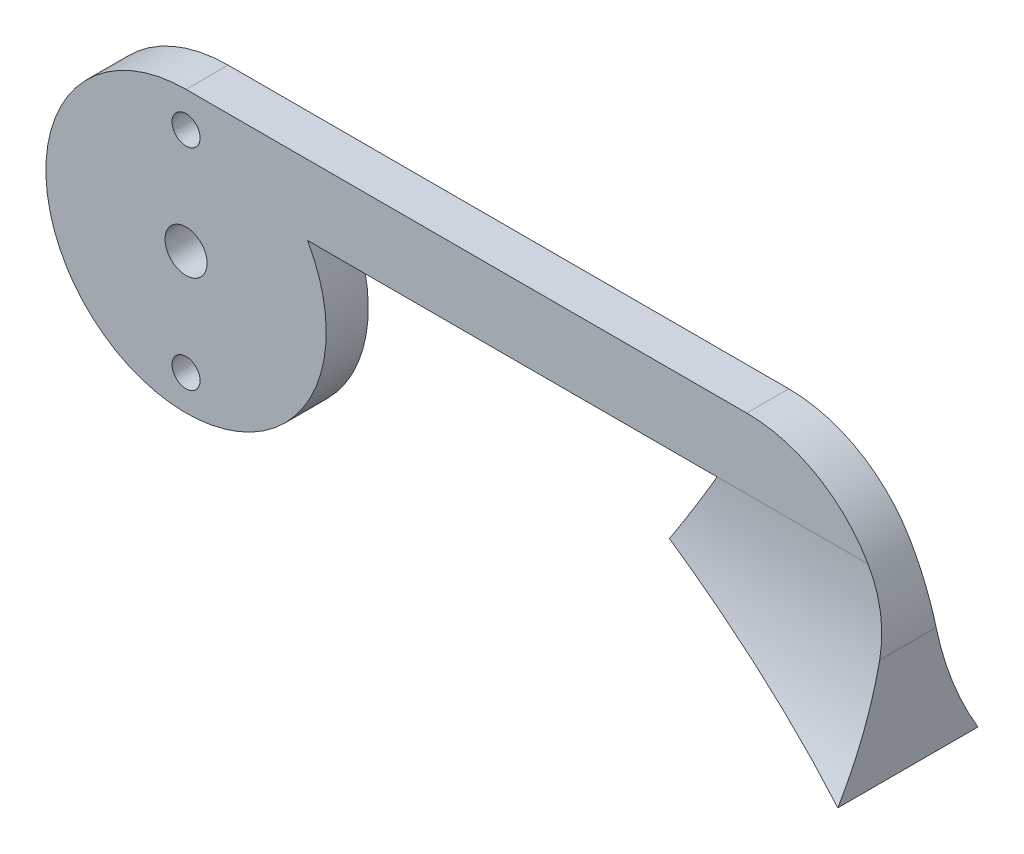
ISO-10303-21;
HEADER;
FILE_DESCRIPTION(('STEP AP214'),'2;1');
FILE_NAME('part.step','',(''),(''),'','','');
FILE_SCHEMA(('AUTOMOTIVE_DESIGN { 1 0 10303 214 1 1 1 1 }'));
ENDSEC;
DATA;
#1=APPLICATION_CONTEXT('core data for automotive mechanical design processes');
#2=APPLICATION_PROTOCOL_DEFINITION('international standard','automotive_design',2000,#1);
#3=PRODUCT_CONTEXT('',#1,'mechanical');
#4=PRODUCT('Part','Part','',(#3));
#5=PRODUCT_RELATED_PRODUCT_CATEGORY('part','',(#4));
#6=PRODUCT_DEFINITION_FORMATION('','',#4);
#7=PRODUCT_DEFINITION_CONTEXT('part definition',#1,'design');
#8=PRODUCT_DEFINITION('design','',#6,#7);
#9=PRODUCT_DEFINITION_SHAPE('','',#8);
#10=(LENGTH_UNIT() NAMED_UNIT(*) SI_UNIT(.MILLI.,.METRE.));
#11=(NAMED_UNIT(*) PLANE_ANGLE_UNIT() SI_UNIT($,.RADIAN.));
#12=(NAMED_UNIT(*) SI_UNIT($,.STERADIAN.) SOLID_ANGLE_UNIT());
#13=UNCERTAINTY_MEASURE_WITH_UNIT(LENGTH_MEASURE(1.E-05),#10,'distance_accuracy_value','');
#14=(GEOMETRIC_REPRESENTATION_CONTEXT(3) GLOBAL_UNCERTAINTY_ASSIGNED_CONTEXT((#13)) GLOBAL_UNIT_ASSIGNED_CONTEXT((#10,
#11,#12)) REPRESENTATION_CONTEXT('',''));
#15=CARTESIAN_POINT('',(0.,0.,0.));
#16=DIRECTION('',(0.,0.,1.));
#17=DIRECTION('',(1.,0.,0.));
#18=AXIS2_PLACEMENT_3D('',#15,#16,#17);
#19=CARTESIAN_POINT('',(40.,0.,1.5));
#20=DIRECTION('',(0.,0.,-1.));
#21=DIRECTION('',(-1.,0.,0.));
#22=AXIS2_PLACEMENT_3D('',#19,#20,#21);
#23=CYLINDRICAL_SURFACE('',#22,10.);
#24=CARTESIAN_POINT('',(40.,0.,1.5));
#25=DIRECTION('',(0.,0.,1.));
#26=DIRECTION('',(0.,-1.,0.));
#27=AXIS2_PLACEMENT_3D('',#24,#25,#26);
#28=CIRCLE('',#27,10.);
#29=CARTESIAN_POINT('',(48.6602540378444,5.,1.5));
#30=VERTEX_POINT('',#29);
#31=CARTESIAN_POINT('',(40.,10.,1.5));
#32=VERTEX_POINT('',#31);
#33=EDGE_CURVE('E153',#30,#32,#28,.T.);
#34=ORIENTED_EDGE('',*,*,#33,.F.);
#35=CARTESIAN_POINT('',(50.,0.,2.01381698103371));
#36=CARTESIAN_POINT('',(50.0000415045389,0.262517746514176,1.95924422946565));
#37=CARTESIAN_POINT('',(49.9896640405455,0.525969076046815,1.90904097072346));
#38=CARTESIAN_POINT('',(49.9479242579216,1.05281929866364,1.81747608824705));
#39=CARTESIAN_POINT('',(49.9165560923865,1.31621815667785,1.77611693225119));
#40=CARTESIAN_POINT('',(49.8336581317333,1.83482498523233,1.70322663335835));
#41=CARTESIAN_POINT('',(49.7826116569452,2.09008145645234,1.67149022231397));
#42=CARTESIAN_POINT('',(49.6605076110851,2.59661387865083,1.61643458150186));
#43=CARTESIAN_POINT('',(49.589457201437,2.84789122021869,1.59311234625727));
#44=CARTESIAN_POINT('',(49.4552349147342,3.2601009370102,1.56109344195631));
#45=CARTESIAN_POINT('',(49.3976050194521,3.42268848799356,1.5501203528109));
#46=CARTESIAN_POINT('',(49.2739310376327,3.74485929821452,1.53153076595463));
#47=CARTESIAN_POINT('',(49.2078859667352,3.9044422034749,1.52391466139056));
#48=CARTESIAN_POINT('',(49.0664744965941,4.22253489501877,1.511773100261));
#49=CARTESIAN_POINT('',(48.99097859854,4.38098897206747,1.50729778407826));
#50=CARTESIAN_POINT('',(48.8317426463199,4.6937345730493,1.50140899832391));
#51=CARTESIAN_POINT('',(48.7480035651893,4.8480265855449,1.49999516782276));
#52=CARTESIAN_POINT('',(48.6602540378444,5.,1.5));
#53=B_SPLINE_CURVE_WITH_KNOTS('',3,(#35,#36,#37,#38,#39,#40,#41,#42,#43,#44,#45,#46,#47,#48,#49,
#50,#51,#52),.UNSPECIFIED.,.F.,.F.,(4,2,2,2,2,2,2,2,4),(0.,0.804192014353112,1.60860812757328,
2.3944106535297,3.1799322185136,3.69823554748103,4.21659956042801,4.74306139262274,
5.26946115496263),.UNSPECIFIED.);
#54=CARTESIAN_POINT('',(50.,0.,2.01381698103371));
#55=VERTEX_POINT('',#54);
#56=EDGE_CURVE('E158',#55,#30,#53,.T.);
#57=ORIENTED_EDGE('',*,*,#56,.F.);
#58=DIRECTION('',(0.,0.,-1.));
#59=VECTOR('',#58,1.);
#60=CARTESIAN_POINT('',(50.,0.,1.5));
#61=LINE('',#60,#59);
#62=CARTESIAN_POINT('',(50.,0.,-2.01381698103371));
#63=VERTEX_POINT('',#62);
#64=EDGE_CURVE('E104',#55,#63,#61,.T.);
#65=ORIENTED_EDGE('',*,*,#64,.T.);
#66=CARTESIAN_POINT('',(48.6602540378444,5.,-1.5));
#67=CARTESIAN_POINT('',(48.794355888389,4.76780427374725,-1.49997140067746));
#68=CARTESIAN_POINT('',(48.9190604891211,4.53016700286462,-1.50328833526677));
#69=CARTESIAN_POINT('',(49.1489604372385,4.04576558179694,-1.51733830242921));
#70=CARTESIAN_POINT('',(49.254150184041,3.79899883583262,-1.5280734598002));
#71=CARTESIAN_POINT('',(49.4420276477239,3.30402666138642,-1.55734296133096));
#72=CARTESIAN_POINT('',(49.5251799428244,3.05598680798395,-1.575690987092));
#73=CARTESIAN_POINT('',(49.6716207318108,2.55497067220455,-1.62059238127503));
#74=CARTESIAN_POINT('',(49.7349163990032,2.30199620764165,-1.64714277965324));
#75=CARTESIAN_POINT('',(49.8584240534306,1.71146035006233,-1.71859254938625));
#76=CARTESIAN_POINT('',(49.9112019486332,1.3726752219491,-1.76664375054361));
#77=CARTESIAN_POINT('',(49.9643626537235,0.861142448873515,-1.85026384890052));
#78=CARTESIAN_POINT('',(49.9777482297035,0.688716605837885,-1.88034162525464));
#79=CARTESIAN_POINT('',(49.9955673365444,0.344078285002523,-1.94426629767427));
#80=CARTESIAN_POINT('',(49.9999997647795,0.171865836093102,-1.97811365744167));
#81=CARTESIAN_POINT('',(50.,0.,-2.01381698103371));
#82=B_SPLINE_CURVE_WITH_KNOTS('',3,(#66,#67,#68,#69,#70,#71,#72,#73,#74,#75,#76,#77,#78,#79,#80,
#81),.UNSPECIFIED.,.F.,.F.,(4,2,2,2,2,2,2,4),(0.,0.804195556242593,1.60862155334646,
2.39442372995741,3.17994170382442,4.21620915085749,4.74260477274713,5.26906521899086),.UNSPECIFIED.);
#83=CARTESIAN_POINT('',(48.6602540378444,5.,-1.5));
#84=VERTEX_POINT('',#83);
#85=EDGE_CURVE('E49',#84,#63,#82,.T.);
#86=ORIENTED_EDGE('',*,*,#85,.F.);
#87=CARTESIAN_POINT('',(40.,0.,-1.5));
#88=DIRECTION('',(0.,0.,-1.));
#89=DIRECTION('',(0.,1.,0.));
#90=AXIS2_PLACEMENT_3D('',#87,#88,#89);
#91=CIRCLE('',#90,10.);
#92=CARTESIAN_POINT('',(40.,10.,-1.5));
#93=VERTEX_POINT('',#92);
#94=EDGE_CURVE('E157',#93,#84,#91,.T.);
#95=ORIENTED_EDGE('',*,*,#94,.F.);
#96=DIRECTION('',(0.,0.,-1.));
#97=VECTOR('',#96,1.);
#98=CARTESIAN_POINT('',(40.,10.,1.5));
#99=LINE('',#98,#97);
#100=EDGE_CURVE('E78',#32,#93,#99,.T.);
#101=ORIENTED_EDGE('',*,*,#100,.F.);
#102=EDGE_LOOP('',(#34,#57,#65,#86,#95,#101));
#103=FACE_BOUND('',#102,.T.);
#104=ADVANCED_FACE('F34',(#103),#23,.T.);
#105=CARTESIAN_POINT('',(0.,10.,1.5));
#106=DIRECTION('',(0.,-1.,0.));
#107=DIRECTION('',(0.,0.,-1.));
#108=AXIS2_PLACEMENT_3D('',#105,#106,#107);
#109=PLANE('',#108);
#110=DIRECTION('',(-1.,0.,0.));
#111=VECTOR('',#110,1.);
#112=CARTESIAN_POINT('',(0.,10.,1.5));
#113=LINE('',#112,#111);
#114=CARTESIAN_POINT('',(0.,10.,1.5));
#115=VERTEX_POINT('',#114);
#116=EDGE_CURVE('E58',#32,#115,#113,.T.);
#117=ORIENTED_EDGE('',*,*,#116,.F.);
#118=ORIENTED_EDGE('',*,*,#100,.T.);
#119=DIRECTION('',(-1.,0.,0.));
#120=VECTOR('',#119,1.);
#121=CARTESIAN_POINT('',(0.,10.,-1.5));
#122=LINE('',#121,#120);
#123=CARTESIAN_POINT('',(0.,10.,-1.5));
#124=VERTEX_POINT('',#123);
#125=EDGE_CURVE('E72',#93,#124,#122,.T.);
#126=ORIENTED_EDGE('',*,*,#125,.T.);
#127=DIRECTION('',(0.,0.,-1.));
#128=VECTOR('',#127,1.);
#129=CARTESIAN_POINT('',(0.,10.,1.5));
#130=LINE('',#129,#128);
#131=EDGE_CURVE('E75',#115,#124,#130,.T.);
#132=ORIENTED_EDGE('',*,*,#131,.F.);
#133=EDGE_LOOP('',(#117,#118,#126,#132));
#134=FACE_BOUND('',#133,.T.);
#135=ADVANCED_FACE('F74',(#134),#109,.F.);
#136=CARTESIAN_POINT('',(50.,-7.64288174241645,5.));
#137=DIRECTION('',(0.453990499739548,0.891006524188367,0.));
#138=DIRECTION('',(-0.891006524188367,0.453990499739548,0.));
#139=AXIS2_PLACEMENT_3D('',#136,#137,#138);
#140=PLANE('',#139);
#141=CARTESIAN_POINT('',(25.1869474724743,5.,26.0846369646753));
#142=DIRECTION('',(0.453990499739548,0.891006524188367,0.));
#143=DIRECTION('',(-0.891006524188367,0.453990499739548,0.));
#144=AXIS2_PLACEMENT_3D('',#141,#142,#143);
#145=ELLIPSE('',#144,54.1523159158163,24.5846369646753);
#146=CARTESIAN_POINT('',(35.,0.,2.0138169810337));
#147=VERTEX_POINT('',#146);
#148=CARTESIAN_POINT('',(50.,-7.64288174241645,5.));
#149=VERTEX_POINT('',#148);
#150=EDGE_CURVE('E209',#147,#149,#145,.F.);
#151=ORIENTED_EDGE('',*,*,#150,.F.);
#152=DIRECTION('',(0.,0.,-1.));
#153=VECTOR('',#152,1.);
#154=CARTESIAN_POINT('',(35.,0.,1.5));
#155=LINE('',#154,#153);
#156=CARTESIAN_POINT('',(35.,0.,-2.0138169810337));
#157=VERTEX_POINT('',#156);
#158=EDGE_CURVE('E107',#147,#157,#155,.T.);
#159=ORIENTED_EDGE('',*,*,#158,.T.);
#160=CARTESIAN_POINT('',(25.1869474724743,5.,-26.0846369646753));
#161=DIRECTION('',(0.453990499739548,0.891006524188367,0.));
#162=DIRECTION('',(-0.891006524188367,0.453990499739548,0.));
#163=AXIS2_PLACEMENT_3D('',#160,#161,#162);
#164=ELLIPSE('',#163,54.1523159158163,24.5846369646753);
#165=CARTESIAN_POINT('',(50.,-7.64288174241644,-5.));
#166=VERTEX_POINT('',#165);
#167=EDGE_CURVE('E228',#166,#157,#164,.F.);
#168=ORIENTED_EDGE('',*,*,#167,.F.);
#169=DIRECTION('',(0.,0.,-1.));
#170=VECTOR('',#169,1.);
#171=CARTESIAN_POINT('',(50.,-7.64288174241645,5.));
#172=LINE('',#171,#170);
#173=EDGE_CURVE('E160',#149,#166,#172,.T.);
#174=ORIENTED_EDGE('',*,*,#173,.F.);
#175=EDGE_LOOP('',(#151,#159,#168,#174));
#176=FACE_BOUND('',#175,.T.);
#177=ADVANCED_FACE('F191',(#176),#140,.F.);
#178=CARTESIAN_POINT('',(0.,0.,1.5));
#179=DIRECTION('',(0.,0.,1.));
#180=DIRECTION('',(1.,0.,0.));
#181=AXIS2_PLACEMENT_3D('',#178,#179,#180);
#182=PLANE('',#181);
#183=CARTESIAN_POINT('',(0.,7.5,1.5));
#184=DIRECTION('',(0.,0.,1.));
#185=DIRECTION('',(1.,0.,0.));
#186=AXIS2_PLACEMENT_3D('',#183,#184,#185);
#187=CIRCLE('',#186,1.);
#188=CARTESIAN_POINT('',(1.,7.5,1.5));
#189=VERTEX_POINT('',#188);
#190=EDGE_CURVE('E239',#189,#189,#187,.T.);
#191=ORIENTED_EDGE('',*,*,#190,.F.);
#192=EDGE_LOOP('',(#191));
#193=FACE_BOUND('',#192,.T.);
#194=CARTESIAN_POINT('',(0.,-7.5,1.5));
#195=DIRECTION('',(0.,0.,1.));
#196=DIRECTION('',(1.,0.,0.));
#197=AXIS2_PLACEMENT_3D('',#194,#195,#196);
#198=CIRCLE('',#197,1.);
#199=CARTESIAN_POINT('',(0.999999999999998,-7.5,1.5));
#200=VERTEX_POINT('',#199);
#201=EDGE_CURVE('E242',#200,#200,#198,.T.);
#202=ORIENTED_EDGE('',*,*,#201,.F.);
#203=EDGE_LOOP('',(#202));
#204=FACE_BOUND('',#203,.T.);
#205=CARTESIAN_POINT('',(0.,0.,1.5));
#206=DIRECTION('',(0.,0.,1.));
#207=DIRECTION('',(1.,0.,0.));
#208=AXIS2_PLACEMENT_3D('',#205,#206,#207);
#209=CIRCLE('',#208,1.5);
#210=CARTESIAN_POINT('',(1.5,0.,1.5));
#211=VERTEX_POINT('',#210);
#212=EDGE_CURVE('E94',#211,#211,#209,.T.);
#213=ORIENTED_EDGE('',*,*,#212,.F.);
#214=EDGE_LOOP('',(#213));
#215=FACE_BOUND('',#214,.T.);
#216=DIRECTION('',(1.,0.,0.));
#217=VECTOR('',#216,1.);
#218=CARTESIAN_POINT('',(8.66025403784439,5.,1.5));
#219=LINE('',#218,#217);
#220=CARTESIAN_POINT('',(8.66025403784439,5.,1.5));
#221=VERTEX_POINT('',#220);
#222=CARTESIAN_POINT('',(37.8867513459482,5.,1.5));
#223=VERTEX_POINT('',#222);
#224=EDGE_CURVE('E128',#221,#223,#219,.T.);
#225=ORIENTED_EDGE('',*,*,#224,.T.);
#226=DIRECTION('',(-1.,0.,0.));
#227=VECTOR('',#226,1.);
#228=CARTESIAN_POINT('',(50.,5.,1.5));
#229=LINE('',#228,#227);
#230=EDGE_CURVE('E134',#30,#223,#229,.T.);
#231=ORIENTED_EDGE('',*,*,#230,.F.);
#232=ORIENTED_EDGE('',*,*,#33,.T.);
#233=ORIENTED_EDGE('',*,*,#116,.T.);
#234=CARTESIAN_POINT('',(0.,0.,1.5));
#235=DIRECTION('',(0.,0.,1.));
#236=DIRECTION('',(1.,0.,0.));
#237=AXIS2_PLACEMENT_3D('',#234,#235,#236);
#238=CIRCLE('',#237,10.);
#239=EDGE_CURVE('E83',#115,#221,#238,.T.);
#240=ORIENTED_EDGE('',*,*,#239,.T.);
#241=EDGE_LOOP('',(#225,#231,#232,#233,#240));
#242=FACE_BOUND('',#241,.T.);
#243=ADVANCED_FACE('F154',(#193,#204,#215,#242),#182,.T.);
#244=CARTESIAN_POINT('',(0.,0.,-1.5));
#245=DIRECTION('',(0.,0.,1.));
#246=DIRECTION('',(1.,0.,0.));
#247=AXIS2_PLACEMENT_3D('',#244,#245,#246);
#248=PLANE('',#247);
#249=CARTESIAN_POINT('',(0.,7.5,-1.5));
#250=DIRECTION('',(0.,0.,-1.));
#251=DIRECTION('',(-1.,0.,0.));
#252=AXIS2_PLACEMENT_3D('',#249,#250,#251);
#253=CIRCLE('',#252,1.);
#254=CARTESIAN_POINT('',(-0.999999999999997,7.5,-1.5));
#255=VERTEX_POINT('',#254);
#256=EDGE_CURVE('E245',#255,#255,#253,.T.);
#257=ORIENTED_EDGE('',*,*,#256,.F.);
#258=EDGE_LOOP('',(#257));
#259=FACE_BOUND('',#258,.T.);
#260=CARTESIAN_POINT('',(0.,-7.5,-1.5));
#261=DIRECTION('',(0.,0.,-1.));
#262=DIRECTION('',(-1.,0.,0.));
#263=AXIS2_PLACEMENT_3D('',#260,#261,#262);
#264=CIRCLE('',#263,1.);
#265=CARTESIAN_POINT('',(-1.,-7.5,-1.5));
#266=VERTEX_POINT('',#265);
#267=EDGE_CURVE('E246',#266,#266,#264,.T.);
#268=ORIENTED_EDGE('',*,*,#267,.F.);
#269=EDGE_LOOP('',(#268));
#270=FACE_BOUND('',#269,.T.);
#271=CARTESIAN_POINT('',(0.,0.,-1.5));
#272=DIRECTION('',(0.,0.,1.));
#273=DIRECTION('',(1.,0.,0.));
#274=AXIS2_PLACEMENT_3D('',#271,#272,#273);
#275=CIRCLE('',#274,1.5);
#276=CARTESIAN_POINT('',(1.5,0.,-1.5));
#277=VERTEX_POINT('',#276);
#278=EDGE_CURVE('E98',#277,#277,#275,.T.);
#279=ORIENTED_EDGE('',*,*,#278,.T.);
#280=EDGE_LOOP('',(#279));
#281=FACE_BOUND('',#280,.T.);
#282=ORIENTED_EDGE('',*,*,#125,.F.);
#283=ORIENTED_EDGE('',*,*,#94,.T.);
#284=DIRECTION('',(-1.,0.,0.));
#285=VECTOR('',#284,1.);
#286=CARTESIAN_POINT('',(50.,5.,-1.5));
#287=LINE('',#286,#285);
#288=CARTESIAN_POINT('',(37.8867513459482,5.,-1.5));
#289=VERTEX_POINT('',#288);
#290=EDGE_CURVE('E229',#84,#289,#287,.T.);
#291=ORIENTED_EDGE('',*,*,#290,.T.);
#292=DIRECTION('',(1.,0.,0.));
#293=VECTOR('',#292,1.);
#294=CARTESIAN_POINT('',(8.66025403784439,5.,-1.5));
#295=LINE('',#294,#293);
#296=CARTESIAN_POINT('',(8.66025403784439,5.,-1.5));
#297=VERTEX_POINT('',#296);
#298=EDGE_CURVE('E84',#297,#289,#295,.T.);
#299=ORIENTED_EDGE('',*,*,#298,.F.);
#300=CARTESIAN_POINT('',(0.,0.,-1.5));
#301=DIRECTION('',(0.,0.,1.));
#302=DIRECTION('',(1.,0.,0.));
#303=AXIS2_PLACEMENT_3D('',#300,#301,#302);
#304=CIRCLE('',#303,10.);
#305=EDGE_CURVE('E89',#124,#297,#304,.T.);
#306=ORIENTED_EDGE('',*,*,#305,.F.);
#307=EDGE_LOOP('',(#282,#283,#291,#299,#306));
#308=FACE_BOUND('',#307,.T.);
#309=ADVANCED_FACE('F91',(#259,#270,#281,#308),#248,.F.);
#310=CARTESIAN_POINT('',(0.,0.,1.5));
#311=DIRECTION('',(0.,0.,-1.));
#312=DIRECTION('',(-1.,0.,0.));
#313=AXIS2_PLACEMENT_3D('',#310,#311,#312);
#314=CYLINDRICAL_SURFACE('',#313,10.);
#315=ORIENTED_EDGE('',*,*,#305,.T.);
#316=DIRECTION('',(0.,0.,-1.));
#317=VECTOR('',#316,1.);
#318=CARTESIAN_POINT('',(8.66025403784439,5.,1.5));
#319=LINE('',#318,#317);
#320=EDGE_CURVE('E12',#221,#297,#319,.T.);
#321=ORIENTED_EDGE('',*,*,#320,.F.);
#322=ORIENTED_EDGE('',*,*,#239,.F.);
#323=ORIENTED_EDGE('',*,*,#131,.T.);
#324=EDGE_LOOP('',(#315,#321,#322,#323));
#325=FACE_BOUND('',#324,.T.);
#326=ADVANCED_FACE('F36',(#325),#314,.T.);
#327=CARTESIAN_POINT('',(8.66025403784439,5.,1.5));
#328=DIRECTION('',(0.,1.,0.));
#329=DIRECTION('',(-1.,0.,0.));
#330=AXIS2_PLACEMENT_3D('',#327,#328,#329);
#331=PLANE('',#330);
#332=ORIENTED_EDGE('',*,*,#298,.T.);
#333=DIRECTION('',(0.,0.,-1.));
#334=VECTOR('',#333,1.);
#335=CARTESIAN_POINT('',(37.8867513459482,5.,1.5));
#336=LINE('',#335,#334);
#337=EDGE_CURVE('E42',#223,#289,#336,.T.);
#338=ORIENTED_EDGE('',*,*,#337,.F.);
#339=ORIENTED_EDGE('',*,*,#224,.F.);
#340=ORIENTED_EDGE('',*,*,#320,.T.);
#341=EDGE_LOOP('',(#332,#338,#339,#340));
#342=FACE_BOUND('',#341,.T.);
#343=ADVANCED_FACE('F127',(#342),#331,.F.);
#344=CARTESIAN_POINT('',(37.8867513459482,5.,1.5));
#345=DIRECTION('',(0.866025403784436,-0.500000000000004,0.));
#346=DIRECTION('',(0.500000000000004,0.866025403784437,0.));
#347=AXIS2_PLACEMENT_3D('',#344,#345,#346);
#348=PLANE('',#347);
#349=CARTESIAN_POINT('',(37.8867513459482,5.,26.0846369646753));
#350=DIRECTION('',(0.866025403784436,-0.500000000000004,0.));
#351=DIRECTION('',(0.500000000000004,0.866025403784437,0.));
#352=AXIS2_PLACEMENT_3D('',#349,#350,#351);
#353=ELLIPSE('',#352,28.3878935389691,24.5846369646753);
#354=EDGE_CURVE('E122',#223,#147,#353,.F.);
#355=ORIENTED_EDGE('',*,*,#354,.F.);
#356=ORIENTED_EDGE('',*,*,#337,.T.);
#357=CARTESIAN_POINT('',(37.8867513459482,5.,-26.0846369646753));
#358=DIRECTION('',(0.866025403784436,-0.500000000000004,0.));
#359=DIRECTION('',(0.500000000000004,0.866025403784437,0.));
#360=AXIS2_PLACEMENT_3D('',#357,#358,#359);
#361=ELLIPSE('',#360,28.3878935389691,24.5846369646753);
#362=EDGE_CURVE('E119',#157,#289,#361,.F.);
#363=ORIENTED_EDGE('',*,*,#362,.F.);
#364=ORIENTED_EDGE('',*,*,#158,.F.);
#365=EDGE_LOOP('',(#355,#356,#363,#364));
#366=FACE_BOUND('',#365,.T.);
#367=ADVANCED_FACE('F115',(#366),#348,.F.);
#368=CARTESIAN_POINT('',(0.,0.,1.5));
#369=DIRECTION('',(0.,0.,-1.));
#370=DIRECTION('',(-1.,0.,0.));
#371=AXIS2_PLACEMENT_3D('',#368,#369,#370);
#372=CYLINDRICAL_SURFACE('',#371,1.5);
#373=ORIENTED_EDGE('',*,*,#212,.T.);
#374=EDGE_LOOP('',(#373));
#375=FACE_BOUND('',#374,.T.);
#376=ORIENTED_EDGE('',*,*,#278,.F.);
#377=EDGE_LOOP('',(#376));
#378=FACE_BOUND('',#377,.T.);
#379=ADVANCED_FACE('F171',(#375,#378),#372,.F.);
#380=CARTESIAN_POINT('',(50.,0.,5.));
#381=DIRECTION('',(-1.,0.,0.));
#382=DIRECTION('',(0.,0.,1.));
#383=AXIS2_PLACEMENT_3D('',#380,#381,#382);
#384=PLANE('',#383);
#385=CARTESIAN_POINT('',(50.,5.,26.0846369646753));
#386=DIRECTION('',(1.,0.,0.));
#387=DIRECTION('',(0.,0.,1.));
#388=AXIS2_PLACEMENT_3D('',#385,#386,#387);
#389=CIRCLE('',#388,24.5846369646753);
#390=EDGE_CURVE('E232',#149,#55,#389,.T.);
#391=ORIENTED_EDGE('',*,*,#390,.F.);
#392=ORIENTED_EDGE('',*,*,#173,.T.);
#393=CARTESIAN_POINT('',(50.,5.,-26.0846369646753));
#394=DIRECTION('',(1.,0.,0.));
#395=DIRECTION('',(0.,0.,-1.));
#396=AXIS2_PLACEMENT_3D('',#393,#394,#395);
#397=CIRCLE('',#396,24.5846369646753);
#398=EDGE_CURVE('E235',#63,#166,#397,.T.);
#399=ORIENTED_EDGE('',*,*,#398,.F.);
#400=ORIENTED_EDGE('',*,*,#64,.F.);
#401=EDGE_LOOP('',(#391,#392,#399,#400));
#402=FACE_BOUND('',#401,.T.);
#403=ADVANCED_FACE('F173',(#402),#384,.F.);
#404=CARTESIAN_POINT('',(50.,5.,26.0846369646753));
#405=DIRECTION('',(-1.,0.,0.));
#406=DIRECTION('',(0.,0.,1.));
#407=AXIS2_PLACEMENT_3D('',#404,#405,#406);
#408=CYLINDRICAL_SURFACE('',#407,24.5846369646753);
#409=ORIENTED_EDGE('',*,*,#56,.T.);
#410=ORIENTED_EDGE('',*,*,#230,.T.);
#411=ORIENTED_EDGE('',*,*,#354,.T.);
#412=ORIENTED_EDGE('',*,*,#150,.T.);
#413=ORIENTED_EDGE('',*,*,#390,.T.);
#414=EDGE_LOOP('',(#409,#410,#411,#412,#413));
#415=FACE_BOUND('',#414,.T.);
#416=ADVANCED_FACE('F180',(#415),#408,.F.);
#417=CARTESIAN_POINT('',(50.,5.,-26.0846369646753));
#418=DIRECTION('',(-1.,0.,0.));
#419=DIRECTION('',(0.,0.,1.));
#420=AXIS2_PLACEMENT_3D('',#417,#418,#419);
#421=CYLINDRICAL_SURFACE('',#420,24.5846369646753);
#422=ORIENTED_EDGE('',*,*,#85,.T.);
#423=ORIENTED_EDGE('',*,*,#398,.T.);
#424=ORIENTED_EDGE('',*,*,#167,.T.);
#425=ORIENTED_EDGE('',*,*,#362,.T.);
#426=ORIENTED_EDGE('',*,*,#290,.F.);
#427=EDGE_LOOP('',(#422,#423,#424,#425,#426));
#428=FACE_BOUND('',#427,.T.);
#429=ADVANCED_FACE('F213',(#428),#421,.F.);
#430=CARTESIAN_POINT('',(0.,-7.5,5.));
#431=DIRECTION('',(0.,0.,-1.));
#432=DIRECTION('',(-1.,0.,0.));
#433=AXIS2_PLACEMENT_3D('',#430,#431,#432);
#434=CYLINDRICAL_SURFACE('',#433,1.);
#435=ORIENTED_EDGE('',*,*,#201,.T.);
#436=EDGE_LOOP('',(#435));
#437=FACE_BOUND('',#436,.T.);
#438=ORIENTED_EDGE('',*,*,#267,.T.);
#439=EDGE_LOOP('',(#438));
#440=FACE_BOUND('',#439,.T.);
#441=ADVANCED_FACE('F214',(#437,#440),#434,.F.);
#442=CARTESIAN_POINT('',(0.,7.5,5.));
#443=DIRECTION('',(0.,0.,-1.));
#444=DIRECTION('',(-1.,0.,0.));
#445=AXIS2_PLACEMENT_3D('',#442,#443,#444);
#446=CYLINDRICAL_SURFACE('',#445,1.);
#447=ORIENTED_EDGE('',*,*,#190,.T.);
#448=EDGE_LOOP('',(#447));
#449=FACE_BOUND('',#448,.T.);
#450=ORIENTED_EDGE('',*,*,#256,.T.);
#451=EDGE_LOOP('',(#450));
#452=FACE_BOUND('',#451,.T.);
#453=ADVANCED_FACE('F252',(#449,#452),#446,.F.);
#454=CLOSED_SHELL('',(#104,#135,#177,#243,#309,#326,#343,#367,#379,#403,#416,#429,#441,#453));
#455=MANIFOLD_SOLID_BREP('B2',#454);
#456=ADVANCED_BREP_SHAPE_REPRESENTATION('',(#18,#455),#14);
#457=SHAPE_DEFINITION_REPRESENTATION(#9,#456);
ENDSEC;
END-ISO-10303-21;
